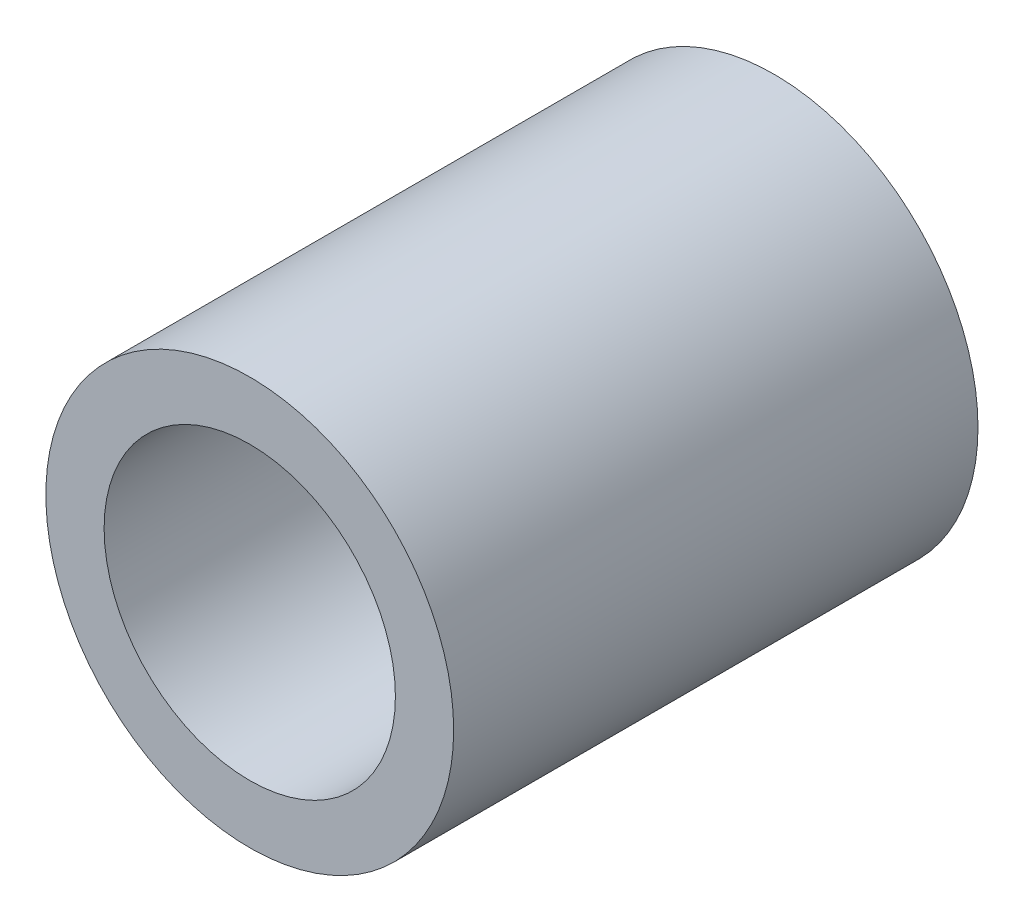
ISO-10303-21;
HEADER;
FILE_DESCRIPTION(('STEP AP214'),'2;1');
FILE_NAME('part.step','',(''),(''),'','','');
FILE_SCHEMA(('AUTOMOTIVE_DESIGN { 1 0 10303 214 1 1 1 1 }'));
ENDSEC;
DATA;
#1=APPLICATION_CONTEXT('core data for automotive mechanical design processes');
#2=APPLICATION_PROTOCOL_DEFINITION('international standard','automotive_design',2000,#1);
#3=PRODUCT_CONTEXT('',#1,'mechanical');
#4=PRODUCT('Part','Part','',(#3));
#5=PRODUCT_RELATED_PRODUCT_CATEGORY('part','',(#4));
#6=PRODUCT_DEFINITION_FORMATION('','',#4);
#7=PRODUCT_DEFINITION_CONTEXT('part definition',#1,'design');
#8=PRODUCT_DEFINITION('design','',#6,#7);
#9=PRODUCT_DEFINITION_SHAPE('','',#8);
#10=(LENGTH_UNIT() NAMED_UNIT(*) SI_UNIT(.MILLI.,.METRE.));
#11=(NAMED_UNIT(*) PLANE_ANGLE_UNIT() SI_UNIT($,.RADIAN.));
#12=(NAMED_UNIT(*) SI_UNIT($,.STERADIAN.) SOLID_ANGLE_UNIT());
#13=UNCERTAINTY_MEASURE_WITH_UNIT(LENGTH_MEASURE(1.E-05),#10,'distance_accuracy_value','');
#14=(GEOMETRIC_REPRESENTATION_CONTEXT(3) GLOBAL_UNCERTAINTY_ASSIGNED_CONTEXT((#13)) GLOBAL_UNIT_ASSIGNED_CONTEXT((#10,
#11,#12)) REPRESENTATION_CONTEXT('',''));
#15=CARTESIAN_POINT('',(0.,0.,0.));
#16=DIRECTION('',(0.,0.,1.));
#17=DIRECTION('',(1.,0.,0.));
#18=AXIS2_PLACEMENT_3D('',#15,#16,#17);
#19=CARTESIAN_POINT('',(0.,0.,9.));
#20=DIRECTION('',(0.,0.,1.));
#21=DIRECTION('',(1.,0.,0.));
#22=AXIS2_PLACEMENT_3D('',#19,#20,#21);
#23=PLANE('',#22);
#24=CARTESIAN_POINT('',(0.,0.,9.));
#25=DIRECTION('',(0.,0.,1.));
#26=DIRECTION('',(1.,0.,0.));
#27=AXIS2_PLACEMENT_3D('',#24,#25,#26);
#28=CIRCLE('',#27,3.5);
#29=CARTESIAN_POINT('',(3.5,0.,9.));
#30=VERTEX_POINT('',#29);
#31=EDGE_CURVE('E10',#30,#30,#28,.T.);
#32=ORIENTED_EDGE('',*,*,#31,.T.);
#33=EDGE_LOOP('',(#32));
#34=FACE_BOUND('',#33,.T.);
#35=CARTESIAN_POINT('',(0.,0.,9.));
#36=DIRECTION('',(0.,0.,1.));
#37=DIRECTION('',(1.,0.,0.));
#38=AXIS2_PLACEMENT_3D('',#35,#36,#37);
#39=CIRCLE('',#38,2.5);
#40=CARTESIAN_POINT('',(2.5,0.,9.));
#41=VERTEX_POINT('',#40);
#42=EDGE_CURVE('E44',#41,#41,#39,.T.);
#43=ORIENTED_EDGE('',*,*,#42,.F.);
#44=EDGE_LOOP('',(#43));
#45=FACE_BOUND('',#44,.T.);
#46=ADVANCED_FACE('F33',(#34,#45),#23,.T.);
#47=CARTESIAN_POINT('',(0.,0.,0.));
#48=DIRECTION('',(0.,0.,1.));
#49=DIRECTION('',(1.,0.,0.));
#50=AXIS2_PLACEMENT_3D('',#47,#48,#49);
#51=PLANE('',#50);
#52=CARTESIAN_POINT('',(0.,0.,0.));
#53=DIRECTION('',(0.,0.,1.));
#54=DIRECTION('',(1.,0.,0.));
#55=AXIS2_PLACEMENT_3D('',#52,#53,#54);
#56=CIRCLE('',#55,3.5);
#57=CARTESIAN_POINT('',(3.5,0.,0.));
#58=VERTEX_POINT('',#57);
#59=EDGE_CURVE('E37',#58,#58,#56,.T.);
#60=ORIENTED_EDGE('',*,*,#59,.F.);
#61=EDGE_LOOP('',(#60));
#62=FACE_BOUND('',#61,.T.);
#63=CARTESIAN_POINT('',(0.,0.,0.));
#64=DIRECTION('',(0.,0.,1.));
#65=DIRECTION('',(1.,0.,0.));
#66=AXIS2_PLACEMENT_3D('',#63,#64,#65);
#67=CIRCLE('',#66,2.5);
#68=CARTESIAN_POINT('',(2.5,0.,0.));
#69=VERTEX_POINT('',#68);
#70=EDGE_CURVE('E46',#69,#69,#67,.T.);
#71=ORIENTED_EDGE('',*,*,#70,.T.);
#72=EDGE_LOOP('',(#71));
#73=FACE_BOUND('',#72,.T.);
#74=ADVANCED_FACE('F56',(#62,#73),#51,.F.);
#75=CARTESIAN_POINT('',(0.,0.,9.));
#76=DIRECTION('',(0.,0.,-1.));
#77=DIRECTION('',(-1.,0.,0.));
#78=AXIS2_PLACEMENT_3D('',#75,#76,#77);
#79=CYLINDRICAL_SURFACE('',#78,3.5);
#80=ORIENTED_EDGE('',*,*,#31,.F.);
#81=EDGE_LOOP('',(#80));
#82=FACE_BOUND('',#81,.T.);
#83=ORIENTED_EDGE('',*,*,#59,.T.);
#84=EDGE_LOOP('',(#83));
#85=FACE_BOUND('',#84,.T.);
#86=ADVANCED_FACE('F35',(#82,#85),#79,.T.);
#87=CARTESIAN_POINT('',(0.,0.,9.));
#88=DIRECTION('',(0.,0.,-1.));
#89=DIRECTION('',(-1.,0.,0.));
#90=AXIS2_PLACEMENT_3D('',#87,#88,#89);
#91=CYLINDRICAL_SURFACE('',#90,2.5);
#92=ORIENTED_EDGE('',*,*,#42,.T.);
#93=EDGE_LOOP('',(#92));
#94=FACE_BOUND('',#93,.T.);
#95=ORIENTED_EDGE('',*,*,#70,.F.);
#96=EDGE_LOOP('',(#95));
#97=FACE_BOUND('',#96,.T.);
#98=ADVANCED_FACE('F52',(#94,#97),#91,.F.);
#99=CLOSED_SHELL('',(#46,#74,#86,#98));
#100=MANIFOLD_SOLID_BREP('B2',#99);
#101=ADVANCED_BREP_SHAPE_REPRESENTATION('',(#18,#100),#14);
#102=SHAPE_DEFINITION_REPRESENTATION(#9,#101);
ENDSEC;
END-ISO-10303-21;
